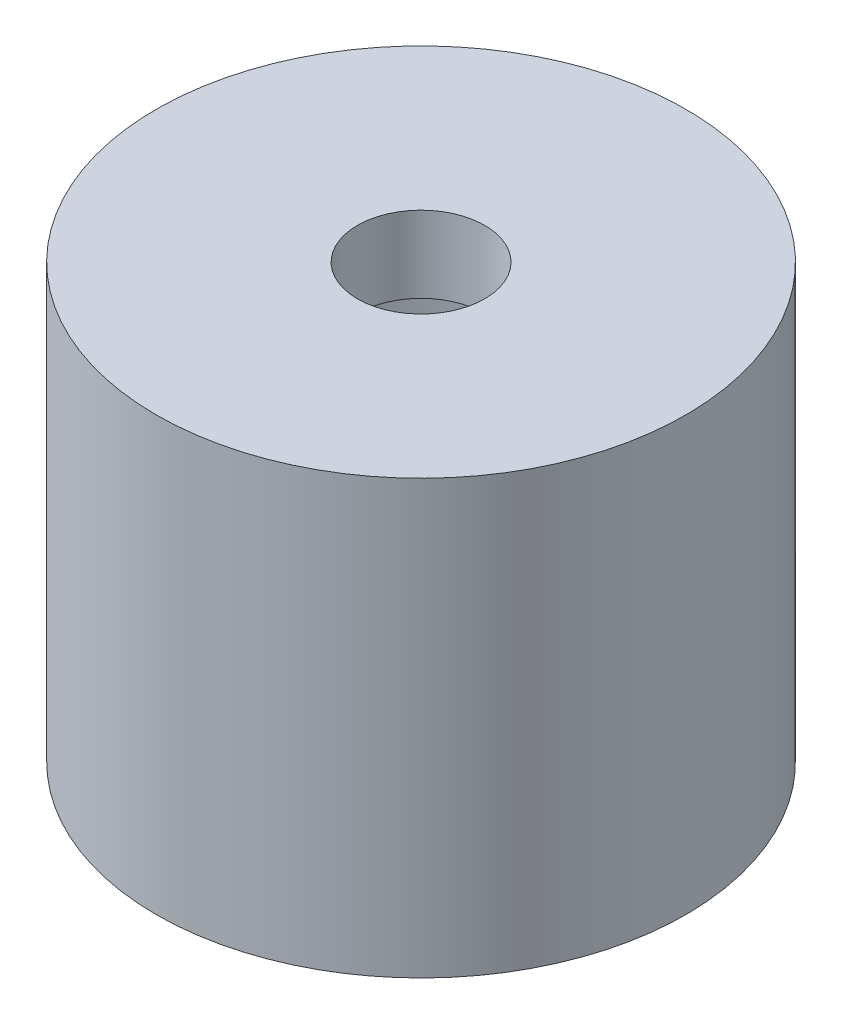
ISO-10303-21;
HEADER;
FILE_DESCRIPTION(('STEP AP214'),'2;1');
FILE_NAME('part.step','',(''),(''),'','','');
FILE_SCHEMA(('AUTOMOTIVE_DESIGN { 1 0 10303 214 1 1 1 1 }'));
ENDSEC;
DATA;
#1=APPLICATION_CONTEXT('core data for automotive mechanical design processes');
#2=APPLICATION_PROTOCOL_DEFINITION('international standard','automotive_design',2000,#1);
#3=PRODUCT_CONTEXT('',#1,'mechanical');
#4=PRODUCT('Part','Part','',(#3));
#5=PRODUCT_RELATED_PRODUCT_CATEGORY('part','',(#4));
#6=PRODUCT_DEFINITION_FORMATION('','',#4);
#7=PRODUCT_DEFINITION_CONTEXT('part definition',#1,'design');
#8=PRODUCT_DEFINITION('design','',#6,#7);
#9=PRODUCT_DEFINITION_SHAPE('','',#8);
#10=(LENGTH_UNIT() NAMED_UNIT(*) SI_UNIT(.MILLI.,.METRE.));
#11=(NAMED_UNIT(*) PLANE_ANGLE_UNIT() SI_UNIT($,.RADIAN.));
#12=(NAMED_UNIT(*) SI_UNIT($,.STERADIAN.) SOLID_ANGLE_UNIT());
#13=UNCERTAINTY_MEASURE_WITH_UNIT(LENGTH_MEASURE(1.E-05),#10,'distance_accuracy_value','');
#14=(GEOMETRIC_REPRESENTATION_CONTEXT(3) GLOBAL_UNCERTAINTY_ASSIGNED_CONTEXT((#13)) GLOBAL_UNIT_ASSIGNED_CONTEXT((#10,
#11,#12)) REPRESENTATION_CONTEXT('',''));
#15=CARTESIAN_POINT('',(0.,0.,0.));
#16=DIRECTION('',(0.,0.,1.));
#17=DIRECTION('',(1.,0.,0.));
#18=AXIS2_PLACEMENT_3D('',#15,#16,#17);
#19=CARTESIAN_POINT('',(0.,-22.225,0.));
#20=DIRECTION('',(0.,1.,0.));
#21=DIRECTION('',(0.,0.,1.));
#22=AXIS2_PLACEMENT_3D('',#19,#20,#21);
#23=CYLINDRICAL_SURFACE('',#22,16.51);
#24=CARTESIAN_POINT('',(0.,-22.225,0.));
#25=DIRECTION('',(0.,1.,0.));
#26=DIRECTION('',(0.,0.,1.));
#27=AXIS2_PLACEMENT_3D('',#24,#25,#26);
#28=CIRCLE('',#27,16.51);
#29=CARTESIAN_POINT('',(0.,-22.225,16.51));
#30=VERTEX_POINT('',#29);
#31=EDGE_CURVE('E10',#30,#30,#28,.T.);
#32=ORIENTED_EDGE('',*,*,#31,.T.);
#33=EDGE_LOOP('',(#32));
#34=FACE_BOUND('',#33,.T.);
#35=CARTESIAN_POINT('',(0.,4.7625,0.));
#36=DIRECTION('',(0.,1.,0.));
#37=DIRECTION('',(0.,0.,1.));
#38=AXIS2_PLACEMENT_3D('',#35,#36,#37);
#39=CIRCLE('',#38,16.51);
#40=CARTESIAN_POINT('',(0.,4.7625,16.51));
#41=VERTEX_POINT('',#40);
#42=EDGE_CURVE('E53',#41,#41,#39,.T.);
#43=ORIENTED_EDGE('',*,*,#42,.F.);
#44=EDGE_LOOP('',(#43));
#45=FACE_BOUND('',#44,.T.);
#46=ADVANCED_FACE('F39',(#34,#45),#23,.T.);
#47=CARTESIAN_POINT('',(0.,-22.225,0.));
#48=DIRECTION('',(0.,1.,0.));
#49=DIRECTION('',(0.,0.,1.));
#50=AXIS2_PLACEMENT_3D('',#47,#48,#49);
#51=PLANE('',#50);
#52=CARTESIAN_POINT('',(0.,-22.225,0.));
#53=DIRECTION('',(0.,1.,0.));
#54=DIRECTION('',(0.,0.,1.));
#55=AXIS2_PLACEMENT_3D('',#52,#53,#54);
#56=CIRCLE('',#55,13.97);
#57=CARTESIAN_POINT('',(0.,-22.225,13.97));
#58=VERTEX_POINT('',#57);
#59=EDGE_CURVE('E44',#58,#58,#56,.T.);
#60=ORIENTED_EDGE('',*,*,#59,.T.);
#61=EDGE_LOOP('',(#60));
#62=FACE_BOUND('',#61,.T.);
#63=ORIENTED_EDGE('',*,*,#31,.F.);
#64=EDGE_LOOP('',(#63));
#65=FACE_BOUND('',#64,.T.);
#66=ADVANCED_FACE('F73',(#62,#65),#51,.F.);
#67=CARTESIAN_POINT('',(0.,-22.225,0.));
#68=DIRECTION('',(0.,1.,0.));
#69=DIRECTION('',(0.,0.,1.));
#70=AXIS2_PLACEMENT_3D('',#67,#68,#69);
#71=CYLINDRICAL_SURFACE('',#70,13.97);
#72=ORIENTED_EDGE('',*,*,#59,.F.);
#73=EDGE_LOOP('',(#72));
#74=FACE_BOUND('',#73,.T.);
#75=CARTESIAN_POINT('',(0.,0.,0.));
#76=DIRECTION('',(0.,1.,0.));
#77=DIRECTION('',(0.,0.,1.));
#78=AXIS2_PLACEMENT_3D('',#75,#76,#77);
#79=CIRCLE('',#78,13.97);
#80=CARTESIAN_POINT('',(0.,0.,13.97));
#81=VERTEX_POINT('',#80);
#82=EDGE_CURVE('E47',#81,#81,#79,.T.);
#83=ORIENTED_EDGE('',*,*,#82,.T.);
#84=EDGE_LOOP('',(#83));
#85=FACE_BOUND('',#84,.T.);
#86=ADVANCED_FACE('F82',(#74,#85),#71,.F.);
#87=CARTESIAN_POINT('',(0.,0.,0.));
#88=DIRECTION('',(0.,1.,0.));
#89=DIRECTION('',(0.,0.,1.));
#90=AXIS2_PLACEMENT_3D('',#87,#88,#89);
#91=PLANE('',#90);
#92=CARTESIAN_POINT('',(0.,0.,0.));
#93=DIRECTION('',(0.,1.,0.));
#94=DIRECTION('',(0.,0.,1.));
#95=AXIS2_PLACEMENT_3D('',#92,#93,#94);
#96=CIRCLE('',#95,3.96875);
#97=CARTESIAN_POINT('',(0.,0.,3.96875));
#98=VERTEX_POINT('',#97);
#99=EDGE_CURVE('E59',#98,#98,#96,.T.);
#100=ORIENTED_EDGE('',*,*,#99,.T.);
#101=EDGE_LOOP('',(#100));
#102=FACE_BOUND('',#101,.T.);
#103=ORIENTED_EDGE('',*,*,#82,.F.);
#104=EDGE_LOOP('',(#103));
#105=FACE_BOUND('',#104,.T.);
#106=ADVANCED_FACE('F66',(#102,#105),#91,.F.);
#107=CARTESIAN_POINT('',(0.,4.7625,0.));
#108=DIRECTION('',(0.,1.,0.));
#109=DIRECTION('',(0.,0.,1.));
#110=AXIS2_PLACEMENT_3D('',#107,#108,#109);
#111=PLANE('',#110);
#112=CARTESIAN_POINT('',(0.,4.7625,0.));
#113=DIRECTION('',(0.,1.,0.));
#114=DIRECTION('',(0.,0.,1.));
#115=AXIS2_PLACEMENT_3D('',#112,#113,#114);
#116=CIRCLE('',#115,3.96875);
#117=CARTESIAN_POINT('',(0.,4.7625,3.96875));
#118=VERTEX_POINT('',#117);
#119=EDGE_CURVE('E63',#118,#118,#116,.T.);
#120=ORIENTED_EDGE('',*,*,#119,.F.);
#121=EDGE_LOOP('',(#120));
#122=FACE_BOUND('',#121,.T.);
#123=ORIENTED_EDGE('',*,*,#42,.T.);
#124=EDGE_LOOP('',(#123));
#125=FACE_BOUND('',#124,.T.);
#126=ADVANCED_FACE('F70',(#122,#125),#111,.T.);
#127=CARTESIAN_POINT('',(0.,4.7625,0.));
#128=DIRECTION('',(0.,1.,0.));
#129=DIRECTION('',(0.,0.,1.));
#130=AXIS2_PLACEMENT_3D('',#127,#128,#129);
#131=CYLINDRICAL_SURFACE('',#130,3.96875);
#132=ORIENTED_EDGE('',*,*,#99,.F.);
#133=EDGE_LOOP('',(#132));
#134=FACE_BOUND('',#133,.T.);
#135=ORIENTED_EDGE('',*,*,#119,.T.);
#136=EDGE_LOOP('',(#135));
#137=FACE_BOUND('',#136,.T.);
#138=ADVANCED_FACE('F61',(#134,#137),#131,.F.);
#139=CLOSED_SHELL('',(#46,#66,#86,#106,#126,#138));
#140=MANIFOLD_SOLID_BREP('B2',#139);
#141=ADVANCED_BREP_SHAPE_REPRESENTATION('',(#18,#140),#14);
#142=SHAPE_DEFINITION_REPRESENTATION(#9,#141);
ENDSEC;
END-ISO-10303-21;
